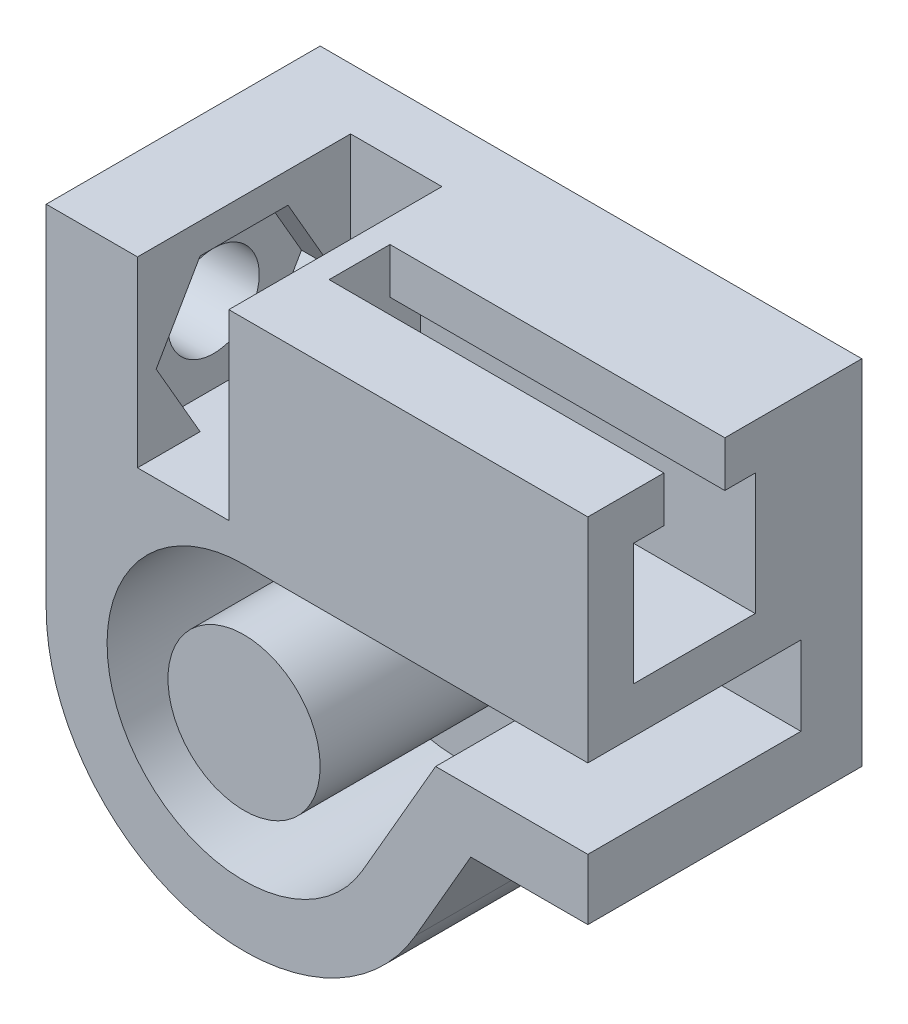
ISO-10303-21;
HEADER;
FILE_DESCRIPTION(('STEP AP214'),'2;1');
FILE_NAME('part.step','',(''),(''),'','','');
FILE_SCHEMA(('AUTOMOTIVE_DESIGN { 1 0 10303 214 1 1 1 1 }'));
ENDSEC;
DATA;
#1=APPLICATION_CONTEXT('core data for automotive mechanical design processes');
#2=APPLICATION_PROTOCOL_DEFINITION('international standard','automotive_design',2000,#1);
#3=PRODUCT_CONTEXT('',#1,'mechanical');
#4=PRODUCT('Part','Part','',(#3));
#5=PRODUCT_RELATED_PRODUCT_CATEGORY('part','',(#4));
#6=PRODUCT_DEFINITION_FORMATION('','',#4);
#7=PRODUCT_DEFINITION_CONTEXT('part definition',#1,'design');
#8=PRODUCT_DEFINITION('design','',#6,#7);
#9=PRODUCT_DEFINITION_SHAPE('','',#8);
#10=(LENGTH_UNIT() NAMED_UNIT(*) SI_UNIT(.MILLI.,.METRE.));
#11=(NAMED_UNIT(*) PLANE_ANGLE_UNIT() SI_UNIT($,.RADIAN.));
#12=(NAMED_UNIT(*) SI_UNIT($,.STERADIAN.) SOLID_ANGLE_UNIT());
#13=UNCERTAINTY_MEASURE_WITH_UNIT(LENGTH_MEASURE(1.E-05),#10,'distance_accuracy_value','');
#14=(GEOMETRIC_REPRESENTATION_CONTEXT(3) GLOBAL_UNCERTAINTY_ASSIGNED_CONTEXT((#13)) GLOBAL_UNIT_ASSIGNED_CONTEXT((#10,
#11,#12)) REPRESENTATION_CONTEXT('',''));
#15=CARTESIAN_POINT('',(0.,0.,0.));
#16=DIRECTION('',(0.,0.,1.));
#17=DIRECTION('',(1.,0.,0.));
#18=AXIS2_PLACEMENT_3D('',#15,#16,#17);
#19=CARTESIAN_POINT('',(0.,0.,0.));
#20=DIRECTION('',(0.,0.,1.));
#21=DIRECTION('',(1.,0.,0.));
#22=AXIS2_PLACEMENT_3D('',#19,#20,#21);
#23=PLANE('',#22);
#24=DIRECTION('',(0.,1.,0.));
#25=VECTOR('',#24,1.);
#26=CARTESIAN_POINT('',(-0.500000000000001,5.5,0.));
#27=LINE('',#26,#25);
#28=CARTESIAN_POINT('',(-0.500000000000001,5.5,0.));
#29=VERTEX_POINT('',#28);
#30=CARTESIAN_POINT('',(-0.500000000000001,11.5,0.));
#31=VERTEX_POINT('',#30);
#32=EDGE_CURVE('E441',#29,#31,#27,.T.);
#33=ORIENTED_EDGE('',*,*,#32,.T.);
#34=DIRECTION('',(-1.,0.,0.));
#35=VECTOR('',#34,1.);
#36=CARTESIAN_POINT('',(0.,11.5,0.));
#37=LINE('',#36,#35);
#38=CARTESIAN_POINT('',(-3.5,11.5,0.));
#39=VERTEX_POINT('',#38);
#40=EDGE_CURVE('E494',#31,#39,#37,.T.);
#41=ORIENTED_EDGE('',*,*,#40,.T.);
#42=DIRECTION('',(0.,-1.,0.));
#43=VECTOR('',#42,1.);
#44=CARTESIAN_POINT('',(-3.5,11.5,0.));
#45=LINE('',#44,#43);
#46=CARTESIAN_POINT('',(-3.5,5.5,0.));
#47=VERTEX_POINT('',#46);
#48=EDGE_CURVE('E106',#39,#47,#45,.T.);
#49=ORIENTED_EDGE('',*,*,#48,.T.);
#50=DIRECTION('',(1.,0.,0.));
#51=VECTOR('',#50,1.);
#52=CARTESIAN_POINT('',(-3.5,5.5,0.));
#53=LINE('',#52,#51);
#54=EDGE_CURVE('E101',#47,#29,#53,.T.);
#55=ORIENTED_EDGE('',*,*,#54,.T.);
#56=EDGE_LOOP('',(#33,#41,#49,#55));
#57=FACE_BOUND('',#56,.T.);
#58=ADVANCED_FACE('F86',(#57),#23,.T.);
#59=CARTESIAN_POINT('',(0.,0.,7.));
#60=DIRECTION('',(0.,0.,-1.));
#61=DIRECTION('',(-1.,0.,0.));
#62=AXIS2_PLACEMENT_3D('',#59,#60,#61);
#63=CYLINDRICAL_SURFACE('',#62,2.5);
#64=CARTESIAN_POINT('',(0.,0.,7.));
#65=DIRECTION('',(0.,0.,1.));
#66=DIRECTION('',(1.,0.,0.));
#67=AXIS2_PLACEMENT_3D('',#64,#65,#66);
#68=CIRCLE('',#67,2.5);
#69=CARTESIAN_POINT('',(2.5,0.,7.));
#70=VERTEX_POINT('',#69);
#71=EDGE_CURVE('E12',#70,#70,#68,.T.);
#72=ORIENTED_EDGE('',*,*,#71,.F.);
#73=EDGE_LOOP('',(#72));
#74=FACE_BOUND('',#73,.T.);
#75=CARTESIAN_POINT('',(0.,0.,0.));
#76=DIRECTION('',(0.,0.,1.));
#77=DIRECTION('',(1.,0.,0.));
#78=AXIS2_PLACEMENT_3D('',#75,#76,#77);
#79=CIRCLE('',#78,2.5);
#80=CARTESIAN_POINT('',(2.5,0.,0.));
#81=VERTEX_POINT('',#80);
#82=EDGE_CURVE('E94',#81,#81,#79,.T.);
#83=ORIENTED_EDGE('',*,*,#82,.T.);
#84=EDGE_LOOP('',(#83));
#85=FACE_BOUND('',#84,.T.);
#86=ADVANCED_FACE('F88',(#74,#85),#63,.T.);
#87=CARTESIAN_POINT('',(0.,0.,7.));
#88=DIRECTION('',(0.,0.,1.));
#89=DIRECTION('',(1.,0.,0.));
#90=AXIS2_PLACEMENT_3D('',#87,#88,#89);
#91=PLANE('',#90);
#92=ORIENTED_EDGE('',*,*,#71,.T.);
#93=EDGE_LOOP('',(#92));
#94=FACE_BOUND('',#93,.T.);
#95=ADVANCED_FACE('F628',(#94),#91,.T.);
#96=CARTESIAN_POINT('',(11.2931179341669,0.,-2.));
#97=DIRECTION('',(-1.,0.,0.));
#98=DIRECTION('',(0.,-1.,0.));
#99=AXIS2_PLACEMENT_3D('',#96,#97,#98);
#100=PLANE('',#99);
#101=DIRECTION('',(0.,0.,1.));
#102=VECTOR('',#101,1.);
#103=CARTESIAN_POINT('',(11.2931179341669,11.5,-2.));
#104=LINE('',#103,#102);
#105=CARTESIAN_POINT('',(11.2931179341669,11.5,-2.));
#106=VERTEX_POINT('',#105);
#107=CARTESIAN_POINT('',(11.2931179341669,11.5,2.5));
#108=VERTEX_POINT('',#107);
#109=EDGE_CURVE('E509',#106,#108,#104,.T.);
#110=ORIENTED_EDGE('',*,*,#109,.T.);
#111=DIRECTION('',(0.,1.,0.));
#112=VECTOR('',#111,1.);
#113=CARTESIAN_POINT('',(11.2931179341669,9.99999999999999,2.5));
#114=LINE('',#113,#112);
#115=CARTESIAN_POINT('',(11.2931179341669,9.99999999999999,2.5));
#116=VERTEX_POINT('',#115);
#117=EDGE_CURVE('E323',#116,#108,#114,.T.);
#118=ORIENTED_EDGE('',*,*,#117,.F.);
#119=DIRECTION('',(0.,0.,1.));
#120=VECTOR('',#119,1.);
#121=CARTESIAN_POINT('',(11.2931179341669,9.99999999999999,2.5));
#122=LINE('',#121,#120);
#123=CARTESIAN_POINT('',(11.2931179341669,9.99999999999999,1.5));
#124=VERTEX_POINT('',#123);
#125=EDGE_CURVE('E321',#124,#116,#122,.T.);
#126=ORIENTED_EDGE('',*,*,#125,.F.);
#127=DIRECTION('',(0.,1.,0.));
#128=VECTOR('',#127,1.);
#129=CARTESIAN_POINT('',(11.2931179341669,9.99999999999999,1.5));
#130=LINE('',#129,#128);
#131=CARTESIAN_POINT('',(11.2931179341669,6.,1.5));
#132=VERTEX_POINT('',#131);
#133=EDGE_CURVE('E283',#132,#124,#130,.T.);
#134=ORIENTED_EDGE('',*,*,#133,.F.);
#135=DIRECTION('',(0.,0.,-1.));
#136=VECTOR('',#135,1.);
#137=CARTESIAN_POINT('',(11.2931179341669,6.,5.5));
#138=LINE('',#137,#136);
#139=CARTESIAN_POINT('',(11.2931179341669,6.,5.5));
#140=VERTEX_POINT('',#139);
#141=EDGE_CURVE('E301',#140,#132,#138,.T.);
#142=ORIENTED_EDGE('',*,*,#141,.F.);
#143=DIRECTION('',(0.,-1.,0.));
#144=VECTOR('',#143,1.);
#145=CARTESIAN_POINT('',(11.2931179341669,9.99999999999999,5.5));
#146=LINE('',#145,#144);
#147=CARTESIAN_POINT('',(11.2931179341669,9.99999999999999,5.5));
#148=VERTEX_POINT('',#147);
#149=EDGE_CURVE('E304',#148,#140,#146,.T.);
#150=ORIENTED_EDGE('',*,*,#149,.F.);
#151=DIRECTION('',(0.,0.,1.));
#152=VECTOR('',#151,1.);
#153=CARTESIAN_POINT('',(11.2931179341669,9.99999999999999,5.5));
#154=LINE('',#153,#152);
#155=CARTESIAN_POINT('',(11.2931179341669,9.99999999999999,4.5));
#156=VERTEX_POINT('',#155);
#157=EDGE_CURVE('E329',#156,#148,#154,.T.);
#158=ORIENTED_EDGE('',*,*,#157,.F.);
#159=DIRECTION('',(0.,-1.,0.));
#160=VECTOR('',#159,1.);
#161=CARTESIAN_POINT('',(11.2931179341669,9.99999999999999,4.5));
#162=LINE('',#161,#160);
#163=CARTESIAN_POINT('',(11.2931179341669,11.5,4.5));
#164=VERTEX_POINT('',#163);
#165=EDGE_CURVE('E326',#164,#156,#162,.T.);
#166=ORIENTED_EDGE('',*,*,#165,.F.);
#167=DIRECTION('',(0.,0.,-1.));
#168=VECTOR('',#167,1.);
#169=CARTESIAN_POINT('',(11.2931179341669,11.5,7.));
#170=LINE('',#169,#168);
#171=CARTESIAN_POINT('',(11.2931179341669,11.5,7.));
#172=VERTEX_POINT('',#171);
#173=EDGE_CURVE('E404',#172,#164,#170,.T.);
#174=ORIENTED_EDGE('',*,*,#173,.F.);
#175=DIRECTION('',(0.,1.,0.));
#176=VECTOR('',#175,1.);
#177=CARTESIAN_POINT('',(11.2931179341669,4.5,7.));
#178=LINE('',#177,#176);
#179=CARTESIAN_POINT('',(11.2931179341669,4.5,7.));
#180=VERTEX_POINT('',#179);
#181=EDGE_CURVE('E483',#180,#172,#178,.T.);
#182=ORIENTED_EDGE('',*,*,#181,.F.);
#183=DIRECTION('',(0.,0.,-1.));
#184=VECTOR('',#183,1.);
#185=CARTESIAN_POINT('',(11.2931179341669,4.5,7.));
#186=LINE('',#185,#184);
#187=CARTESIAN_POINT('',(11.2931179341669,4.5,0.));
#188=VERTEX_POINT('',#187);
#189=EDGE_CURVE('E391',#180,#188,#186,.T.);
#190=ORIENTED_EDGE('',*,*,#189,.T.);
#191=DIRECTION('',(0.,-1.,0.));
#192=VECTOR('',#191,1.);
#193=CARTESIAN_POINT('',(11.2931179341669,0.,0.));
#194=LINE('',#193,#192);
#195=CARTESIAN_POINT('',(11.2931179341669,1.9,0.));
#196=VERTEX_POINT('',#195);
#197=EDGE_CURVE('E446',#188,#196,#194,.T.);
#198=ORIENTED_EDGE('',*,*,#197,.T.);
#199=DIRECTION('',(0.,0.,-1.));
#200=VECTOR('',#199,1.);
#201=CARTESIAN_POINT('',(11.2931179341669,1.9,7.));
#202=LINE('',#201,#200);
#203=CARTESIAN_POINT('',(11.2931179341669,1.9,7.));
#204=VERTEX_POINT('',#203);
#205=EDGE_CURVE('E419',#204,#196,#202,.T.);
#206=ORIENTED_EDGE('',*,*,#205,.F.);
#207=DIRECTION('',(0.,1.,0.));
#208=VECTOR('',#207,1.);
#209=CARTESIAN_POINT('',(11.2931179341669,-0.0999999999999994,7.));
#210=LINE('',#209,#208);
#211=CARTESIAN_POINT('',(11.2931179341669,-0.0999999999999994,7.));
#212=VERTEX_POINT('',#211);
#213=EDGE_CURVE('E455',#212,#204,#210,.T.);
#214=ORIENTED_EDGE('',*,*,#213,.F.);
#215=DIRECTION('',(0.,0.,1.));
#216=VECTOR('',#215,1.);
#217=CARTESIAN_POINT('',(11.2931179341669,-0.0999999999999994,-2.));
#218=LINE('',#217,#216);
#219=CARTESIAN_POINT('',(11.2931179341669,-0.0999999999999994,-2.));
#220=VERTEX_POINT('',#219);
#221=EDGE_CURVE('E513',#220,#212,#218,.T.);
#222=ORIENTED_EDGE('',*,*,#221,.F.);
#223=DIRECTION('',(0.,-1.,0.));
#224=VECTOR('',#223,1.);
#225=CARTESIAN_POINT('',(11.2931179341669,0.,-2.));
#226=LINE('',#225,#224);
#227=EDGE_CURVE('E491',#106,#220,#226,.T.);
#228=ORIENTED_EDGE('',*,*,#227,.F.);
#229=EDGE_LOOP('',(#110,#118,#126,#134,#142,#150,#158,#166,#174,#182,#190,#198,#206,#214,#222,#228));
#230=FACE_BOUND('',#229,.T.);
#231=ADVANCED_FACE('F537',(#230),#100,.F.);
#232=CARTESIAN_POINT('',(0.,-0.0999999999999994,-2.));
#233=DIRECTION('',(0.,-1.,0.));
#234=DIRECTION('',(0.,0.,-1.));
#235=AXIS2_PLACEMENT_3D('',#232,#233,#234);
#236=PLANE('',#235);
#237=ORIENTED_EDGE('',*,*,#221,.T.);
#238=DIRECTION('',(1.,0.,0.));
#239=VECTOR('',#238,1.);
#240=CARTESIAN_POINT('',(7.44781847254616,-0.0999999999999994,7.));
#241=LINE('',#240,#239);
#242=CARTESIAN_POINT('',(7.44781847254616,-0.0999999999999994,7.));
#243=VERTEX_POINT('',#242);
#244=EDGE_CURVE('E457',#243,#212,#241,.T.);
#245=ORIENTED_EDGE('',*,*,#244,.F.);
#246=DIRECTION('',(0.,0.,1.));
#247=VECTOR('',#246,1.);
#248=CARTESIAN_POINT('',(7.44781847254616,-0.0999999999999994,-2.));
#249=LINE('',#248,#247);
#250=CARTESIAN_POINT('',(7.44781847254616,-0.0999999999999994,-2.));
#251=VERTEX_POINT('',#250);
#252=EDGE_CURVE('E515',#251,#243,#249,.T.);
#253=ORIENTED_EDGE('',*,*,#252,.F.);
#254=DIRECTION('',(1.,0.,0.));
#255=VECTOR('',#254,1.);
#256=CARTESIAN_POINT('',(0.,-0.0999999999999994,-2.));
#257=LINE('',#256,#255);
#258=EDGE_CURVE('E506',#251,#220,#257,.T.);
#259=ORIENTED_EDGE('',*,*,#258,.T.);
#260=EDGE_LOOP('',(#237,#245,#253,#259));
#261=FACE_BOUND('',#260,.T.);
#262=ADVANCED_FACE('F561',(#261),#236,.T.);
#263=CARTESIAN_POINT('',(5.62916512459886,-3.24999999999998,-2.));
#264=DIRECTION('',(0.86602540378444,-0.499999999999998,0.));
#265=DIRECTION('',(0.499999999999998,0.86602540378444,0.));
#266=AXIS2_PLACEMENT_3D('',#263,#264,#265);
#267=PLANE('',#266);
#268=ORIENTED_EDGE('',*,*,#252,.T.);
#269=DIRECTION('',(-0.499999999999998,-0.86602540378444,0.));
#270=VECTOR('',#269,1.);
#271=CARTESIAN_POINT('',(7.44781847254616,-0.0999999999999994,7.));
#272=LINE('',#271,#270);
#273=CARTESIAN_POINT('',(5.62916512459886,-3.24999999999998,7.));
#274=VERTEX_POINT('',#273);
#275=EDGE_CURVE('E460',#243,#274,#272,.T.);
#276=ORIENTED_EDGE('',*,*,#275,.T.);
#277=DIRECTION('',(0.,0.,1.));
#278=VECTOR('',#277,1.);
#279=CARTESIAN_POINT('',(5.62916512459886,-3.24999999999998,-2.));
#280=LINE('',#279,#278);
#281=CARTESIAN_POINT('',(5.62916512459886,-3.24999999999998,-2.));
#282=VERTEX_POINT('',#281);
#283=EDGE_CURVE('E517',#282,#274,#280,.T.);
#284=ORIENTED_EDGE('',*,*,#283,.F.);
#285=DIRECTION('',(0.499999999999998,0.86602540378444,0.));
#286=VECTOR('',#285,1.);
#287=CARTESIAN_POINT('',(5.62916512459886,-3.24999999999998,-2.));
#288=LINE('',#287,#286);
#289=EDGE_CURVE('E503',#282,#251,#288,.T.);
#290=ORIENTED_EDGE('',*,*,#289,.T.);
#291=EDGE_LOOP('',(#268,#276,#284,#290));
#292=FACE_BOUND('',#291,.T.);
#293=ADVANCED_FACE('F615',(#292),#267,.T.);
#294=CARTESIAN_POINT('',(0.,0.,-2.));
#295=DIRECTION('',(0.,0.,1.));
#296=DIRECTION('',(1.,0.,0.));
#297=AXIS2_PLACEMENT_3D('',#294,#295,#296);
#298=CYLINDRICAL_SURFACE('',#297,6.5);
#299=ORIENTED_EDGE('',*,*,#283,.T.);
#300=CARTESIAN_POINT('',(0.,0.,7.));
#301=DIRECTION('',(0.,0.,1.));
#302=DIRECTION('',(1.,0.,0.));
#303=AXIS2_PLACEMENT_3D('',#300,#301,#302);
#304=CIRCLE('',#303,6.5);
#305=CARTESIAN_POINT('',(-6.5,0.,7.));
#306=VERTEX_POINT('',#305);
#307=EDGE_CURVE('E463',#306,#274,#304,.T.);
#308=ORIENTED_EDGE('',*,*,#307,.F.);
#309=DIRECTION('',(0.,0.,1.));
#310=VECTOR('',#309,1.);
#311=CARTESIAN_POINT('',(-6.5,0.,-2.));
#312=LINE('',#311,#310);
#313=CARTESIAN_POINT('',(-6.5,0.,-2.));
#314=VERTEX_POINT('',#313);
#315=EDGE_CURVE('E519',#314,#306,#312,.T.);
#316=ORIENTED_EDGE('',*,*,#315,.F.);
#317=CARTESIAN_POINT('',(0.,0.,-2.));
#318=DIRECTION('',(0.,0.,1.));
#319=DIRECTION('',(1.,0.,0.));
#320=AXIS2_PLACEMENT_3D('',#317,#318,#319);
#321=CIRCLE('',#320,6.5);
#322=EDGE_CURVE('E500',#314,#282,#321,.T.);
#323=ORIENTED_EDGE('',*,*,#322,.T.);
#324=EDGE_LOOP('',(#299,#308,#316,#323));
#325=FACE_BOUND('',#324,.T.);
#326=ADVANCED_FACE('F613',(#325),#298,.T.);
#327=CARTESIAN_POINT('',(-6.5,0.,-2.));
#328=DIRECTION('',(-1.,0.,0.));
#329=DIRECTION('',(0.,-1.,0.));
#330=AXIS2_PLACEMENT_3D('',#327,#328,#329);
#331=PLANE('',#330);
#332=ORIENTED_EDGE('',*,*,#315,.T.);
#333=DIRECTION('',(0.,-1.,0.));
#334=VECTOR('',#333,1.);
#335=CARTESIAN_POINT('',(-6.5,11.5,7.));
#336=LINE('',#335,#334);
#337=CARTESIAN_POINT('',(-6.5,11.5,7.));
#338=VERTEX_POINT('',#337);
#339=EDGE_CURVE('E466',#338,#306,#336,.T.);
#340=ORIENTED_EDGE('',*,*,#339,.F.);
#341=DIRECTION('',(0.,0.,1.));
#342=VECTOR('',#341,1.);
#343=CARTESIAN_POINT('',(-6.5,11.5,-2.));
#344=LINE('',#343,#342);
#345=CARTESIAN_POINT('',(-6.5,11.5,-2.));
#346=VERTEX_POINT('',#345);
#347=EDGE_CURVE('E521',#346,#338,#344,.T.);
#348=ORIENTED_EDGE('',*,*,#347,.F.);
#349=DIRECTION('',(0.,-1.,0.));
#350=VECTOR('',#349,1.);
#351=CARTESIAN_POINT('',(-6.5,0.,-2.));
#352=LINE('',#351,#350);
#353=EDGE_CURVE('E497',#346,#314,#352,.T.);
#354=ORIENTED_EDGE('',*,*,#353,.T.);
#355=EDGE_LOOP('',(#332,#340,#348,#354));
#356=FACE_BOUND('',#355,.T.);
#357=CARTESIAN_POINT('',(-6.5,8.,3.5));
#358=DIRECTION('',(1.,0.,0.));
#359=DIRECTION('',(0.,1.,0.));
#360=AXIS2_PLACEMENT_3D('',#357,#358,#359);
#361=CIRCLE('',#360,1.5);
#362=CARTESIAN_POINT('',(-6.5,9.5,3.5));
#363=VERTEX_POINT('',#362);
#364=EDGE_CURVE('E349',#363,#363,#361,.T.);
#365=ORIENTED_EDGE('',*,*,#364,.T.);
#366=EDGE_LOOP('',(#365));
#367=FACE_BOUND('',#366,.T.);
#368=ADVANCED_FACE('F610',(#356,#367),#331,.T.);
#369=CARTESIAN_POINT('',(0.,11.5,-2.));
#370=DIRECTION('',(0.,1.,0.));
#371=DIRECTION('',(-1.,0.,0.));
#372=AXIS2_PLACEMENT_3D('',#369,#370,#371);
#373=PLANE('',#372);
#374=ORIENTED_EDGE('',*,*,#40,.F.);
#375=DIRECTION('',(0.,0.,-1.));
#376=VECTOR('',#375,1.);
#377=CARTESIAN_POINT('',(-0.500000000000001,11.5,7.));
#378=LINE('',#377,#376);
#379=CARTESIAN_POINT('',(-0.500000000000001,11.5,7.));
#380=VERTEX_POINT('',#379);
#381=EDGE_CURVE('E407',#380,#31,#378,.T.);
#382=ORIENTED_EDGE('',*,*,#381,.F.);
#383=DIRECTION('',(-1.,0.,0.));
#384=VECTOR('',#383,1.);
#385=CARTESIAN_POINT('',(11.2931179341669,11.5,7.));
#386=LINE('',#385,#384);
#387=EDGE_CURVE('E481',#172,#380,#386,.T.);
#388=ORIENTED_EDGE('',*,*,#387,.F.);
#389=ORIENTED_EDGE('',*,*,#173,.T.);
#390=DIRECTION('',(1.,0.,0.));
#391=VECTOR('',#390,1.);
#392=CARTESIAN_POINT('',(0.293117934166908,11.5,4.5));
#393=LINE('',#392,#391);
#394=CARTESIAN_POINT('',(0.293117934166908,11.5,4.5));
#395=VERTEX_POINT('',#394);
#396=EDGE_CURVE('E343',#395,#164,#393,.T.);
#397=ORIENTED_EDGE('',*,*,#396,.F.);
#398=DIRECTION('',(0.,0.,1.));
#399=VECTOR('',#398,1.);
#400=CARTESIAN_POINT('',(0.293117934166908,11.5,4.5));
#401=LINE('',#400,#399);
#402=CARTESIAN_POINT('',(0.293117934166908,11.5,2.5));
#403=VERTEX_POINT('',#402);
#404=EDGE_CURVE('E308',#403,#395,#401,.T.);
#405=ORIENTED_EDGE('',*,*,#404,.F.);
#406=DIRECTION('',(1.,0.,0.));
#407=VECTOR('',#406,1.);
#408=CARTESIAN_POINT('',(0.293117934166908,11.5,2.5));
#409=LINE('',#408,#407);
#410=EDGE_CURVE('E345',#403,#108,#409,.T.);
#411=ORIENTED_EDGE('',*,*,#410,.T.);
#412=ORIENTED_EDGE('',*,*,#109,.F.);
#413=DIRECTION('',(-1.,0.,0.));
#414=VECTOR('',#413,1.);
#415=CARTESIAN_POINT('',(0.,11.5,-2.));
#416=LINE('',#415,#414);
#417=EDGE_CURVE('E493',#106,#346,#416,.T.);
#418=ORIENTED_EDGE('',*,*,#417,.T.);
#419=ORIENTED_EDGE('',*,*,#347,.T.);
#420=DIRECTION('',(-1.,0.,0.));
#421=VECTOR('',#420,1.);
#422=CARTESIAN_POINT('',(-3.5,11.5,7.));
#423=LINE('',#422,#421);
#424=CARTESIAN_POINT('',(-3.5,11.5,7.));
#425=VERTEX_POINT('',#424);
#426=EDGE_CURVE('E469',#425,#338,#423,.T.);
#427=ORIENTED_EDGE('',*,*,#426,.F.);
#428=DIRECTION('',(0.,0.,-1.));
#429=VECTOR('',#428,1.);
#430=CARTESIAN_POINT('',(-3.5,11.5,7.));
#431=LINE('',#430,#429);
#432=EDGE_CURVE('E416',#425,#39,#431,.T.);
#433=ORIENTED_EDGE('',*,*,#432,.T.);
#434=EDGE_LOOP('',(#374,#382,#388,#389,#397,#405,#411,#412,#418,#419,#427,#433));
#435=FACE_BOUND('',#434,.T.);
#436=ADVANCED_FACE('F575',(#435),#373,.T.);
#437=CARTESIAN_POINT('',(0.,0.,-2.));
#438=DIRECTION('',(0.,0.,1.));
#439=DIRECTION('',(1.,0.,0.));
#440=AXIS2_PLACEMENT_3D('',#437,#438,#439);
#441=PLANE('',#440);
#442=ORIENTED_EDGE('',*,*,#227,.T.);
#443=ORIENTED_EDGE('',*,*,#258,.F.);
#444=ORIENTED_EDGE('',*,*,#289,.F.);
#445=ORIENTED_EDGE('',*,*,#322,.F.);
#446=ORIENTED_EDGE('',*,*,#353,.F.);
#447=ORIENTED_EDGE('',*,*,#417,.F.);
#448=EDGE_LOOP('',(#442,#443,#444,#445,#446,#447));
#449=FACE_BOUND('',#448,.T.);
#450=ADVANCED_FACE('F531',(#449),#441,.F.);
#451=ORIENTED_EDGE('',*,*,#82,.F.);
#452=EDGE_LOOP('',(#451));
#453=FACE_BOUND('',#452,.T.);
#454=ORIENTED_EDGE('',*,*,#197,.F.);
#455=DIRECTION('',(1.,0.,0.));
#456=VECTOR('',#455,1.);
#457=CARTESIAN_POINT('',(0.,4.5,0.));
#458=LINE('',#457,#456);
#459=CARTESIAN_POINT('',(0.,4.5,0.));
#460=VERTEX_POINT('',#459);
#461=EDGE_CURVE('E443',#460,#188,#458,.T.);
#462=ORIENTED_EDGE('',*,*,#461,.F.);
#463=CARTESIAN_POINT('',(0.,0.,0.));
#464=DIRECTION('',(0.,0.,1.));
#465=DIRECTION('',(1.,0.,0.));
#466=AXIS2_PLACEMENT_3D('',#463,#464,#465);
#467=CIRCLE('',#466,4.5);
#468=CARTESIAN_POINT('',(3.89711431702998,-2.24999999999999,0.));
#469=VERTEX_POINT('',#468);
#470=EDGE_CURVE('E432',#460,#469,#467,.T.);
#471=ORIENTED_EDGE('',*,*,#470,.T.);
#472=DIRECTION('',(0.499999999999998,0.86602540378444,0.));
#473=VECTOR('',#472,1.);
#474=CARTESIAN_POINT('',(3.89711431702998,-2.24999999999999,0.));
#475=LINE('',#474,#473);
#476=CARTESIAN_POINT('',(6.29311793416691,1.9,0.));
#477=VERTEX_POINT('',#476);
#478=EDGE_CURVE('E434',#469,#477,#475,.T.);
#479=ORIENTED_EDGE('',*,*,#478,.T.);
#480=DIRECTION('',(1.,0.,0.));
#481=VECTOR('',#480,1.);
#482=CARTESIAN_POINT('',(6.29311793416691,1.9,0.));
#483=LINE('',#482,#481);
#484=EDGE_CURVE('E437',#477,#196,#483,.T.);
#485=ORIENTED_EDGE('',*,*,#484,.T.);
#486=EDGE_LOOP('',(#454,#462,#471,#479,#485));
#487=FACE_BOUND('',#486,.T.);
#488=ADVANCED_FACE('F527',(#453,#487),#23,.T.);
#489=CARTESIAN_POINT('',(-6.5,8.,3.5));
#490=DIRECTION('',(1.,0.,0.));
#491=DIRECTION('',(0.,1.,0.));
#492=AXIS2_PLACEMENT_3D('',#489,#490,#491);
#493=CYLINDRICAL_SURFACE('',#492,1.5);
#494=CARTESIAN_POINT('',(-0.5,8.,3.5));
#495=DIRECTION('',(-1.,0.,0.));
#496=DIRECTION('',(0.,0.,1.));
#497=AXIS2_PLACEMENT_3D('',#494,#495,#496);
#498=CIRCLE('',#497,1.5);
#499=CARTESIAN_POINT('',(-0.5,8.,5.));
#500=VERTEX_POINT('',#499);
#501=EDGE_CURVE('E353',#500,#500,#498,.T.);
#502=ORIENTED_EDGE('',*,*,#501,.T.);
#503=EDGE_LOOP('',(#502));
#504=FACE_BOUND('',#503,.T.);
#505=CARTESIAN_POINT('',(0.293117934166904,8.,3.5));
#506=DIRECTION('',(1.,0.,0.));
#507=DIRECTION('',(0.,1.,0.));
#508=AXIS2_PLACEMENT_3D('',#505,#506,#507);
#509=CIRCLE('',#508,1.5);
#510=CARTESIAN_POINT('',(0.293117934166906,9.5,3.5));
#511=VERTEX_POINT('',#510);
#512=EDGE_CURVE('E336',#511,#511,#509,.F.);
#513=ORIENTED_EDGE('',*,*,#512,.F.);
#514=EDGE_LOOP('',(#513));
#515=FACE_BOUND('',#514,.T.);
#516=ADVANCED_FACE('F530',(#504,#515),#493,.F.);
#517=CARTESIAN_POINT('',(0.,4.5,7.));
#518=DIRECTION('',(0.,1.,0.));
#519=DIRECTION('',(0.,0.,1.));
#520=AXIS2_PLACEMENT_3D('',#517,#518,#519);
#521=PLANE('',#520);
#522=ORIENTED_EDGE('',*,*,#461,.T.);
#523=ORIENTED_EDGE('',*,*,#189,.F.);
#524=DIRECTION('',(1.,0.,0.));
#525=VECTOR('',#524,1.);
#526=CARTESIAN_POINT('',(0.,4.5,7.));
#527=LINE('',#526,#525);
#528=CARTESIAN_POINT('',(0.,4.5,7.));
#529=VERTEX_POINT('',#528);
#530=EDGE_CURVE('E435',#529,#180,#527,.T.);
#531=ORIENTED_EDGE('',*,*,#530,.F.);
#532=DIRECTION('',(0.,0.,-1.));
#533=VECTOR('',#532,1.);
#534=CARTESIAN_POINT('',(0.,4.5,7.));
#535=LINE('',#534,#533);
#536=EDGE_CURVE('E428',#529,#460,#535,.T.);
#537=ORIENTED_EDGE('',*,*,#536,.T.);
#538=EDGE_LOOP('',(#522,#523,#531,#537));
#539=FACE_BOUND('',#538,.T.);
#540=ADVANCED_FACE('F541',(#539),#521,.F.);
#541=CARTESIAN_POINT('',(-0.500000000000001,5.5,7.));
#542=DIRECTION('',(-1.,0.,0.));
#543=DIRECTION('',(0.,0.,1.));
#544=AXIS2_PLACEMENT_3D('',#541,#542,#543);
#545=PLANE('',#544);
#546=ORIENTED_EDGE('',*,*,#501,.F.);
#547=EDGE_LOOP('',(#546));
#548=FACE_BOUND('',#547,.T.);
#549=ORIENTED_EDGE('',*,*,#32,.F.);
#550=DIRECTION('',(0.,0.,-1.));
#551=VECTOR('',#550,1.);
#552=CARTESIAN_POINT('',(-0.500000000000001,5.5,7.));
#553=LINE('',#552,#551);
#554=CARTESIAN_POINT('',(-0.500000000000001,5.5,7.));
#555=VERTEX_POINT('',#554);
#556=EDGE_CURVE('E410',#555,#29,#553,.T.);
#557=ORIENTED_EDGE('',*,*,#556,.F.);
#558=DIRECTION('',(0.,1.,0.));
#559=VECTOR('',#558,1.);
#560=CARTESIAN_POINT('',(-0.500000000000001,5.5,7.));
#561=LINE('',#560,#559);
#562=EDGE_CURVE('E478',#555,#380,#561,.T.);
#563=ORIENTED_EDGE('',*,*,#562,.T.);
#564=ORIENTED_EDGE('',*,*,#381,.T.);
#565=EDGE_LOOP('',(#549,#557,#563,#564));
#566=FACE_BOUND('',#565,.T.);
#567=ADVANCED_FACE('F646',(#548,#566),#545,.T.);
#568=CARTESIAN_POINT('',(-3.5,5.5,7.));
#569=DIRECTION('',(0.,1.,0.));
#570=DIRECTION('',(-1.,0.,0.));
#571=AXIS2_PLACEMENT_3D('',#568,#569,#570);
#572=PLANE('',#571);
#573=ORIENTED_EDGE('',*,*,#54,.F.);
#574=DIRECTION('',(0.,0.,-1.));
#575=VECTOR('',#574,1.);
#576=CARTESIAN_POINT('',(-3.5,5.5,7.));
#577=LINE('',#576,#575);
#578=CARTESIAN_POINT('',(-3.5,5.5,2.05662432702593));
#579=VERTEX_POINT('',#578);
#580=EDGE_CURVE('E412',#579,#47,#577,.T.);
#581=ORIENTED_EDGE('',*,*,#580,.F.);
#582=DIRECTION('',(1.,0.,0.));
#583=VECTOR('',#582,1.);
#584=CARTESIAN_POINT('',(-4.5,5.5,2.05662432702593));
#585=LINE('',#584,#583);
#586=CARTESIAN_POINT('',(-4.5,5.5,2.05662432702593));
#587=VERTEX_POINT('',#586);
#588=EDGE_CURVE('E389',#587,#579,#585,.T.);
#589=ORIENTED_EDGE('',*,*,#588,.F.);
#590=DIRECTION('',(0.,0.,-1.));
#591=VECTOR('',#590,1.);
#592=CARTESIAN_POINT('',(-4.5,5.5,4.94337567297407));
#593=LINE('',#592,#591);
#594=CARTESIAN_POINT('',(-4.5,5.5,4.94337567297407));
#595=VERTEX_POINT('',#594);
#596=EDGE_CURVE('E373',#595,#587,#593,.T.);
#597=ORIENTED_EDGE('',*,*,#596,.F.);
#598=DIRECTION('',(1.,0.,0.));
#599=VECTOR('',#598,1.);
#600=CARTESIAN_POINT('',(-4.5,5.5,4.94337567297407));
#601=LINE('',#600,#599);
#602=CARTESIAN_POINT('',(-3.5,5.5,4.94337567297407));
#603=VERTEX_POINT('',#602);
#604=EDGE_CURVE('E392',#595,#603,#601,.T.);
#605=ORIENTED_EDGE('',*,*,#604,.T.);
#606=CARTESIAN_POINT('',(-3.5,5.5,7.));
#607=VERTEX_POINT('',#606);
#608=EDGE_CURVE('E413',#607,#603,#577,.T.);
#609=ORIENTED_EDGE('',*,*,#608,.F.);
#610=DIRECTION('',(1.,0.,0.));
#611=VECTOR('',#610,1.);
#612=CARTESIAN_POINT('',(-3.5,5.5,7.));
#613=LINE('',#612,#611);
#614=EDGE_CURVE('E475',#607,#555,#613,.T.);
#615=ORIENTED_EDGE('',*,*,#614,.T.);
#616=ORIENTED_EDGE('',*,*,#556,.T.);
#617=EDGE_LOOP('',(#573,#581,#589,#597,#605,#609,#615,#616));
#618=FACE_BOUND('',#617,.T.);
#619=ADVANCED_FACE('F598',(#618),#572,.T.);
#620=CARTESIAN_POINT('',(-3.5,11.5,7.));
#621=DIRECTION('',(1.,0.,0.));
#622=DIRECTION('',(0.,1.,0.));
#623=AXIS2_PLACEMENT_3D('',#620,#621,#622);
#624=PLANE('',#623);
#625=DIRECTION('',(0.,0.866025403784439,-0.5));
#626=VECTOR('',#625,1.);
#627=CARTESIAN_POINT('',(-3.5,5.5,2.05662432702593));
#628=LINE('',#627,#626);
#629=CARTESIAN_POINT('',(-3.5,8.,0.613248654051869));
#630=VERTEX_POINT('',#629);
#631=EDGE_CURVE('E356',#579,#630,#628,.T.);
#632=ORIENTED_EDGE('',*,*,#631,.F.);
#633=ORIENTED_EDGE('',*,*,#580,.T.);
#634=ORIENTED_EDGE('',*,*,#48,.F.);
#635=ORIENTED_EDGE('',*,*,#432,.F.);
#636=DIRECTION('',(0.,-1.,0.));
#637=VECTOR('',#636,1.);
#638=CARTESIAN_POINT('',(-3.5,11.5,7.));
#639=LINE('',#638,#637);
#640=EDGE_CURVE('E472',#425,#607,#639,.T.);
#641=ORIENTED_EDGE('',*,*,#640,.T.);
#642=ORIENTED_EDGE('',*,*,#608,.T.);
#643=DIRECTION('',(0.,-0.866025403784438,-0.5));
#644=VECTOR('',#643,1.);
#645=CARTESIAN_POINT('',(-3.5,8.,6.38675134594813));
#646=LINE('',#645,#644);
#647=CARTESIAN_POINT('',(-3.5,8.,6.38675134594813));
#648=VERTEX_POINT('',#647);
#649=EDGE_CURVE('E361',#648,#603,#646,.T.);
#650=ORIENTED_EDGE('',*,*,#649,.F.);
#651=DIRECTION('',(0.,-0.866025403784438,0.500000000000001));
#652=VECTOR('',#651,1.);
#653=CARTESIAN_POINT('',(-3.5,10.5,4.94337567297407));
#654=LINE('',#653,#652);
#655=CARTESIAN_POINT('',(-3.5,10.5,4.94337567297407));
#656=VERTEX_POINT('',#655);
#657=EDGE_CURVE('E384',#656,#648,#654,.T.);
#658=ORIENTED_EDGE('',*,*,#657,.F.);
#659=DIRECTION('',(0.,0.,1.));
#660=VECTOR('',#659,1.);
#661=CARTESIAN_POINT('',(-3.5,10.5,2.05662432702594));
#662=LINE('',#661,#660);
#663=CARTESIAN_POINT('',(-3.5,10.5,2.05662432702594));
#664=VERTEX_POINT('',#663);
#665=EDGE_CURVE('E381',#664,#656,#662,.T.);
#666=ORIENTED_EDGE('',*,*,#665,.F.);
#667=DIRECTION('',(0.,0.866025403784439,0.5));
#668=VECTOR('',#667,1.);
#669=CARTESIAN_POINT('',(-3.5,8.,0.613248654051869));
#670=LINE('',#669,#668);
#671=EDGE_CURVE('E378',#630,#664,#670,.T.);
#672=ORIENTED_EDGE('',*,*,#671,.F.);
#673=EDGE_LOOP('',(#632,#633,#634,#635,#641,#642,#650,#658,#666,#672));
#674=FACE_BOUND('',#673,.T.);
#675=ADVANCED_FACE('F604',(#674),#624,.T.);
#676=CARTESIAN_POINT('',(6.29311793416691,1.9,7.));
#677=DIRECTION('',(0.,1.,0.));
#678=DIRECTION('',(0.,0.,1.));
#679=AXIS2_PLACEMENT_3D('',#676,#677,#678);
#680=PLANE('',#679);
#681=ORIENTED_EDGE('',*,*,#484,.F.);
#682=DIRECTION('',(0.,0.,-1.));
#683=VECTOR('',#682,1.);
#684=CARTESIAN_POINT('',(6.29311793416691,1.9,7.));
#685=LINE('',#684,#683);
#686=CARTESIAN_POINT('',(6.29311793416691,1.9,7.));
#687=VERTEX_POINT('',#686);
#688=EDGE_CURVE('E422',#687,#477,#685,.T.);
#689=ORIENTED_EDGE('',*,*,#688,.F.);
#690=DIRECTION('',(1.,0.,0.));
#691=VECTOR('',#690,1.);
#692=CARTESIAN_POINT('',(6.29311793416691,1.9,7.));
#693=LINE('',#692,#691);
#694=EDGE_CURVE('E452',#687,#204,#693,.T.);
#695=ORIENTED_EDGE('',*,*,#694,.T.);
#696=ORIENTED_EDGE('',*,*,#205,.T.);
#697=EDGE_LOOP('',(#681,#689,#695,#696));
#698=FACE_BOUND('',#697,.T.);
#699=ADVANCED_FACE('F552',(#698),#680,.T.);
#700=CARTESIAN_POINT('',(3.89711431702998,-2.24999999999999,7.));
#701=DIRECTION('',(-0.86602540378444,0.499999999999998,0.));
#702=DIRECTION('',(-0.499999999999998,-0.86602540378444,0.));
#703=AXIS2_PLACEMENT_3D('',#700,#701,#702);
#704=PLANE('',#703);
#705=ORIENTED_EDGE('',*,*,#478,.F.);
#706=DIRECTION('',(0.,0.,-1.));
#707=VECTOR('',#706,1.);
#708=CARTESIAN_POINT('',(3.89711431702998,-2.24999999999999,7.));
#709=LINE('',#708,#707);
#710=CARTESIAN_POINT('',(3.89711431702998,-2.24999999999999,7.));
#711=VERTEX_POINT('',#710);
#712=EDGE_CURVE('E425',#711,#469,#709,.T.);
#713=ORIENTED_EDGE('',*,*,#712,.F.);
#714=DIRECTION('',(0.499999999999998,0.86602540378444,0.));
#715=VECTOR('',#714,1.);
#716=CARTESIAN_POINT('',(3.89711431702998,-2.24999999999999,7.));
#717=LINE('',#716,#715);
#718=EDGE_CURVE('E449',#711,#687,#717,.T.);
#719=ORIENTED_EDGE('',*,*,#718,.T.);
#720=ORIENTED_EDGE('',*,*,#688,.T.);
#721=EDGE_LOOP('',(#705,#713,#719,#720));
#722=FACE_BOUND('',#721,.T.);
#723=ADVANCED_FACE('F548',(#722),#704,.T.);
#724=CARTESIAN_POINT('',(0.,0.,7.));
#725=DIRECTION('',(0.,0.,-1.));
#726=DIRECTION('',(-1.,0.,0.));
#727=AXIS2_PLACEMENT_3D('',#724,#725,#726);
#728=CYLINDRICAL_SURFACE('',#727,4.5);
#729=ORIENTED_EDGE('',*,*,#470,.F.);
#730=ORIENTED_EDGE('',*,*,#536,.F.);
#731=CARTESIAN_POINT('',(0.,0.,7.));
#732=DIRECTION('',(0.,0.,1.));
#733=DIRECTION('',(1.,0.,0.));
#734=AXIS2_PLACEMENT_3D('',#731,#732,#733);
#735=CIRCLE('',#734,4.5);
#736=EDGE_CURVE('E431',#529,#711,#735,.T.);
#737=ORIENTED_EDGE('',*,*,#736,.T.);
#738=ORIENTED_EDGE('',*,*,#712,.T.);
#739=EDGE_LOOP('',(#729,#730,#737,#738));
#740=FACE_BOUND('',#739,.T.);
#741=ADVANCED_FACE('F545',(#740),#728,.F.);
#742=CARTESIAN_POINT('',(0.,0.,7.));
#743=DIRECTION('',(0.,0.,1.));
#744=DIRECTION('',(1.,0.,0.));
#745=AXIS2_PLACEMENT_3D('',#742,#743,#744);
#746=PLANE('',#745);
#747=ORIENTED_EDGE('',*,*,#530,.T.);
#748=ORIENTED_EDGE('',*,*,#181,.T.);
#749=ORIENTED_EDGE('',*,*,#387,.T.);
#750=ORIENTED_EDGE('',*,*,#562,.F.);
#751=ORIENTED_EDGE('',*,*,#614,.F.);
#752=ORIENTED_EDGE('',*,*,#640,.F.);
#753=ORIENTED_EDGE('',*,*,#426,.T.);
#754=ORIENTED_EDGE('',*,*,#339,.T.);
#755=ORIENTED_EDGE('',*,*,#307,.T.);
#756=ORIENTED_EDGE('',*,*,#275,.F.);
#757=ORIENTED_EDGE('',*,*,#244,.T.);
#758=ORIENTED_EDGE('',*,*,#213,.T.);
#759=ORIENTED_EDGE('',*,*,#694,.F.);
#760=ORIENTED_EDGE('',*,*,#718,.F.);
#761=ORIENTED_EDGE('',*,*,#736,.F.);
#762=EDGE_LOOP('',(#747,#748,#749,#750,#751,#752,#753,#754,#755,#756,#757,#758,#759,#760,#761));
#763=FACE_BOUND('',#762,.T.);
#764=ADVANCED_FACE('F557',(#763),#746,.T.);
#765=CARTESIAN_POINT('',(-4.5,5.5,2.05662432702593));
#766=DIRECTION('',(0.,-0.5,-0.866025403784439));
#767=DIRECTION('',(0.,0.866025403784439,-0.5));
#768=AXIS2_PLACEMENT_3D('',#765,#766,#767);
#769=PLANE('',#768);
#770=ORIENTED_EDGE('',*,*,#631,.T.);
#771=DIRECTION('',(1.,0.,0.));
#772=VECTOR('',#771,1.);
#773=CARTESIAN_POINT('',(-4.5,8.,0.613248654051869));
#774=LINE('',#773,#772);
#775=CARTESIAN_POINT('',(-4.5,8.,0.613248654051869));
#776=VERTEX_POINT('',#775);
#777=EDGE_CURVE('E376',#776,#630,#774,.T.);
#778=ORIENTED_EDGE('',*,*,#777,.F.);
#779=DIRECTION('',(0.,0.866025403784439,-0.5));
#780=VECTOR('',#779,1.);
#781=CARTESIAN_POINT('',(-4.5,5.5,2.05662432702593));
#782=LINE('',#781,#780);
#783=EDGE_CURVE('E357',#587,#776,#782,.T.);
#784=ORIENTED_EDGE('',*,*,#783,.F.);
#785=ORIENTED_EDGE('',*,*,#588,.T.);
#786=EDGE_LOOP('',(#770,#778,#784,#785));
#787=FACE_BOUND('',#786,.T.);
#788=ADVANCED_FACE('F635',(#787),#769,.F.);
#789=CARTESIAN_POINT('',(-4.5,8.,6.38675134594813));
#790=DIRECTION('',(0.,-0.5,0.866025403784439));
#791=DIRECTION('',(0.,-0.866025403784438,-0.5));
#792=AXIS2_PLACEMENT_3D('',#789,#790,#791);
#793=PLANE('',#792);
#794=ORIENTED_EDGE('',*,*,#649,.T.);
#795=ORIENTED_EDGE('',*,*,#604,.F.);
#796=DIRECTION('',(0.,-0.866025403784438,-0.5));
#797=VECTOR('',#796,1.);
#798=CARTESIAN_POINT('',(-4.5,8.,6.38675134594813));
#799=LINE('',#798,#797);
#800=CARTESIAN_POINT('',(-4.5,8.,6.38675134594813));
#801=VERTEX_POINT('',#800);
#802=EDGE_CURVE('E370',#801,#595,#799,.T.);
#803=ORIENTED_EDGE('',*,*,#802,.F.);
#804=DIRECTION('',(1.,0.,0.));
#805=VECTOR('',#804,1.);
#806=CARTESIAN_POINT('',(-4.5,8.,6.38675134594813));
#807=LINE('',#806,#805);
#808=EDGE_CURVE('E394',#801,#648,#807,.T.);
#809=ORIENTED_EDGE('',*,*,#808,.T.);
#810=EDGE_LOOP('',(#794,#795,#803,#809));
#811=FACE_BOUND('',#810,.T.);
#812=ADVANCED_FACE('F654',(#811),#793,.F.);
#813=CARTESIAN_POINT('',(-4.5,10.5,4.94337567297407));
#814=DIRECTION('',(0.,0.500000000000001,0.866025403784438));
#815=DIRECTION('',(0.,-0.866025403784438,0.500000000000001));
#816=AXIS2_PLACEMENT_3D('',#813,#814,#815);
#817=PLANE('',#816);
#818=ORIENTED_EDGE('',*,*,#657,.T.);
#819=ORIENTED_EDGE('',*,*,#808,.F.);
#820=DIRECTION('',(0.,-0.866025403784438,0.500000000000001));
#821=VECTOR('',#820,1.);
#822=CARTESIAN_POINT('',(-4.5,10.5,4.94337567297407));
#823=LINE('',#822,#821);
#824=CARTESIAN_POINT('',(-4.5,10.5,4.94337567297407));
#825=VERTEX_POINT('',#824);
#826=EDGE_CURVE('E367',#825,#801,#823,.T.);
#827=ORIENTED_EDGE('',*,*,#826,.F.);
#828=DIRECTION('',(1.,0.,0.));
#829=VECTOR('',#828,1.);
#830=CARTESIAN_POINT('',(-4.5,10.5,4.94337567297407));
#831=LINE('',#830,#829);
#832=EDGE_CURVE('E396',#825,#656,#831,.T.);
#833=ORIENTED_EDGE('',*,*,#832,.T.);
#834=EDGE_LOOP('',(#818,#819,#827,#833));
#835=FACE_BOUND('',#834,.T.);
#836=ADVANCED_FACE('F664',(#835),#817,.F.);
#837=CARTESIAN_POINT('',(-4.5,10.5,2.05662432702594));
#838=DIRECTION('',(0.,1.,0.));
#839=DIRECTION('',(0.,0.,1.));
#840=AXIS2_PLACEMENT_3D('',#837,#838,#839);
#841=PLANE('',#840);
#842=ORIENTED_EDGE('',*,*,#665,.T.);
#843=ORIENTED_EDGE('',*,*,#832,.F.);
#844=DIRECTION('',(0.,0.,1.));
#845=VECTOR('',#844,1.);
#846=CARTESIAN_POINT('',(-4.5,10.5,2.05662432702594));
#847=LINE('',#846,#845);
#848=CARTESIAN_POINT('',(-4.5,10.5,2.05662432702594));
#849=VERTEX_POINT('',#848);
#850=EDGE_CURVE('E364',#849,#825,#847,.T.);
#851=ORIENTED_EDGE('',*,*,#850,.F.);
#852=DIRECTION('',(1.,0.,0.));
#853=VECTOR('',#852,1.);
#854=CARTESIAN_POINT('',(-4.5,10.5,2.05662432702594));
#855=LINE('',#854,#853);
#856=EDGE_CURVE('E398',#849,#664,#855,.T.);
#857=ORIENTED_EDGE('',*,*,#856,.T.);
#858=EDGE_LOOP('',(#842,#843,#851,#857));
#859=FACE_BOUND('',#858,.T.);
#860=ADVANCED_FACE('F660',(#859),#841,.F.);
#861=CARTESIAN_POINT('',(-4.5,8.,0.613248654051869));
#862=DIRECTION('',(0.,0.5,-0.866025403784439));
#863=DIRECTION('',(0.,0.866025403784439,0.5));
#864=AXIS2_PLACEMENT_3D('',#861,#862,#863);
#865=PLANE('',#864);
#866=ORIENTED_EDGE('',*,*,#671,.T.);
#867=ORIENTED_EDGE('',*,*,#856,.F.);
#868=DIRECTION('',(0.,0.866025403784439,0.5));
#869=VECTOR('',#868,1.);
#870=CARTESIAN_POINT('',(-4.5,8.,0.613248654051869));
#871=LINE('',#870,#869);
#872=EDGE_CURVE('E360',#776,#849,#871,.T.);
#873=ORIENTED_EDGE('',*,*,#872,.F.);
#874=ORIENTED_EDGE('',*,*,#777,.T.);
#875=EDGE_LOOP('',(#866,#867,#873,#874));
#876=FACE_BOUND('',#875,.T.);
#877=ADVANCED_FACE('F656',(#876),#865,.F.);
#878=CARTESIAN_POINT('',(-4.5,0.,0.));
#879=DIRECTION('',(1.,0.,0.));
#880=DIRECTION('',(0.,1.,0.));
#881=AXIS2_PLACEMENT_3D('',#878,#879,#880);
#882=PLANE('',#881);
#883=CARTESIAN_POINT('',(-4.5,8.,3.5));
#884=DIRECTION('',(1.,0.,0.));
#885=DIRECTION('',(0.,1.,0.));
#886=AXIS2_PLACEMENT_3D('',#883,#884,#885);
#887=CIRCLE('',#886,1.5);
#888=CARTESIAN_POINT('',(-4.5,9.5,3.5));
#889=VERTEX_POINT('',#888);
#890=EDGE_CURVE('E352',#889,#889,#887,.T.);
#891=ORIENTED_EDGE('',*,*,#890,.F.);
#892=EDGE_LOOP('',(#891));
#893=FACE_BOUND('',#892,.T.);
#894=ORIENTED_EDGE('',*,*,#783,.T.);
#895=ORIENTED_EDGE('',*,*,#872,.T.);
#896=ORIENTED_EDGE('',*,*,#850,.T.);
#897=ORIENTED_EDGE('',*,*,#826,.T.);
#898=ORIENTED_EDGE('',*,*,#802,.T.);
#899=ORIENTED_EDGE('',*,*,#596,.T.);
#900=EDGE_LOOP('',(#894,#895,#896,#897,#898,#899));
#901=FACE_BOUND('',#900,.T.);
#902=ADVANCED_FACE('F659',(#893,#901),#882,.T.);
#903=ORIENTED_EDGE('',*,*,#890,.T.);
#904=EDGE_LOOP('',(#903));
#905=FACE_BOUND('',#904,.T.);
#906=ORIENTED_EDGE('',*,*,#364,.F.);
#907=EDGE_LOOP('',(#906));
#908=FACE_BOUND('',#907,.T.);
#909=ADVANCED_FACE('F674',(#905,#908),#493,.F.);
#910=CARTESIAN_POINT('',(0.293117934166897,0.,0.));
#911=DIRECTION('',(1.,0.,0.));
#912=DIRECTION('',(0.,1.,0.));
#913=AXIS2_PLACEMENT_3D('',#910,#911,#912);
#914=PLANE('',#913);
#915=DIRECTION('',(0.,1.,0.));
#916=VECTOR('',#915,1.);
#917=CARTESIAN_POINT('',(0.293117934166906,10.,1.5));
#918=LINE('',#917,#916);
#919=CARTESIAN_POINT('',(0.293117934166903,6.,1.5));
#920=VERTEX_POINT('',#919);
#921=CARTESIAN_POINT('',(0.293117934166906,10.,1.5));
#922=VERTEX_POINT('',#921);
#923=EDGE_CURVE('E280',#920,#922,#918,.T.);
#924=ORIENTED_EDGE('',*,*,#923,.T.);
#925=DIRECTION('',(0.,0.,1.));
#926=VECTOR('',#925,1.);
#927=CARTESIAN_POINT('',(0.293117934166906,10.,2.5));
#928=LINE('',#927,#926);
#929=CARTESIAN_POINT('',(0.293117934166906,10.,2.5));
#930=VERTEX_POINT('',#929);
#931=EDGE_CURVE('E291',#922,#930,#928,.T.);
#932=ORIENTED_EDGE('',*,*,#931,.T.);
#933=DIRECTION('',(0.,1.,0.));
#934=VECTOR('',#933,1.);
#935=CARTESIAN_POINT('',(0.293117934166906,10.,2.5));
#936=LINE('',#935,#934);
#937=EDGE_CURVE('E295',#930,#403,#936,.T.);
#938=ORIENTED_EDGE('',*,*,#937,.T.);
#939=ORIENTED_EDGE('',*,*,#404,.T.);
#940=DIRECTION('',(0.,-1.,0.));
#941=VECTOR('',#940,1.);
#942=CARTESIAN_POINT('',(0.293117934166906,10.,4.5));
#943=LINE('',#942,#941);
#944=CARTESIAN_POINT('',(0.293117934166906,10.,4.5));
#945=VERTEX_POINT('',#944);
#946=EDGE_CURVE('E311',#395,#945,#943,.T.);
#947=ORIENTED_EDGE('',*,*,#946,.T.);
#948=DIRECTION('',(0.,0.,1.));
#949=VECTOR('',#948,1.);
#950=CARTESIAN_POINT('',(0.293117934166906,10.,5.5));
#951=LINE('',#950,#949);
#952=CARTESIAN_POINT('',(0.293117934166906,10.,5.5));
#953=VERTEX_POINT('',#952);
#954=EDGE_CURVE('E314',#945,#953,#951,.T.);
#955=ORIENTED_EDGE('',*,*,#954,.T.);
#956=DIRECTION('',(0.,-1.,0.));
#957=VECTOR('',#956,1.);
#958=CARTESIAN_POINT('',(0.293117934166906,10.,5.5));
#959=LINE('',#958,#957);
#960=CARTESIAN_POINT('',(0.293117934166903,6.,5.5));
#961=VERTEX_POINT('',#960);
#962=EDGE_CURVE('E317',#953,#961,#959,.T.);
#963=ORIENTED_EDGE('',*,*,#962,.T.);
#964=DIRECTION('',(0.,0.,-1.));
#965=VECTOR('',#964,1.);
#966=CARTESIAN_POINT('',(0.293117934166903,6.,5.5));
#967=LINE('',#966,#965);
#968=EDGE_CURVE('E288',#961,#920,#967,.T.);
#969=ORIENTED_EDGE('',*,*,#968,.T.);
#970=EDGE_LOOP('',(#924,#932,#938,#939,#947,#955,#963,#969));
#971=FACE_BOUND('',#970,.T.);
#972=ORIENTED_EDGE('',*,*,#512,.T.);
#973=EDGE_LOOP('',(#972));
#974=FACE_BOUND('',#973,.T.);
#975=ADVANCED_FACE('F297',(#971,#974),#914,.T.);
#976=CARTESIAN_POINT('',(0.293117934166906,10.,1.5));
#977=DIRECTION('',(0.,0.,-1.));
#978=DIRECTION('',(0.,1.,0.));
#979=AXIS2_PLACEMENT_3D('',#976,#977,#978);
#980=PLANE('',#979);
#981=ORIENTED_EDGE('',*,*,#133,.T.);
#982=DIRECTION('',(1.,0.,0.));
#983=VECTOR('',#982,1.);
#984=CARTESIAN_POINT('',(0.293117934166906,10.,1.5));
#985=LINE('',#984,#983);
#986=EDGE_CURVE('E276',#922,#124,#985,.T.);
#987=ORIENTED_EDGE('',*,*,#986,.F.);
#988=ORIENTED_EDGE('',*,*,#923,.F.);
#989=DIRECTION('',(1.,0.,0.));
#990=VECTOR('',#989,1.);
#991=CARTESIAN_POINT('',(0.293117934166903,6.,1.5));
#992=LINE('',#991,#990);
#993=EDGE_CURVE('E334',#920,#132,#992,.T.);
#994=ORIENTED_EDGE('',*,*,#993,.T.);
#995=EDGE_LOOP('',(#981,#987,#988,#994));
#996=FACE_BOUND('',#995,.T.);
#997=ADVANCED_FACE('F278',(#996),#980,.F.);
#998=CARTESIAN_POINT('',(0.293117934166903,6.,5.5));
#999=DIRECTION('',(0.,-1.,0.));
#1000=DIRECTION('',(1.,0.,0.));
#1001=AXIS2_PLACEMENT_3D('',#998,#999,#1000);
#1002=PLANE('',#1001);
#1003=ORIENTED_EDGE('',*,*,#141,.T.);
#1004=ORIENTED_EDGE('',*,*,#993,.F.);
#1005=ORIENTED_EDGE('',*,*,#968,.F.);
#1006=DIRECTION('',(1.,0.,0.));
#1007=VECTOR('',#1006,1.);
#1008=CARTESIAN_POINT('',(0.293117934166903,6.,5.5));
#1009=LINE('',#1008,#1007);
#1010=EDGE_CURVE('E337',#961,#140,#1009,.T.);
#1011=ORIENTED_EDGE('',*,*,#1010,.T.);
#1012=EDGE_LOOP('',(#1003,#1004,#1005,#1011));
#1013=FACE_BOUND('',#1012,.T.);
#1014=ADVANCED_FACE('F589',(#1013),#1002,.F.);
#1015=CARTESIAN_POINT('',(0.293117934166906,10.,5.5));
#1016=DIRECTION('',(0.,0.,1.));
#1017=DIRECTION('',(0.,-1.,0.));
#1018=AXIS2_PLACEMENT_3D('',#1015,#1016,#1017);
#1019=PLANE('',#1018);
#1020=ORIENTED_EDGE('',*,*,#149,.T.);
#1021=ORIENTED_EDGE('',*,*,#1010,.F.);
#1022=ORIENTED_EDGE('',*,*,#962,.F.);
#1023=DIRECTION('',(1.,0.,0.));
#1024=VECTOR('',#1023,1.);
#1025=CARTESIAN_POINT('',(0.293117934166906,10.,5.5));
#1026=LINE('',#1025,#1024);
#1027=EDGE_CURVE('E339',#953,#148,#1026,.T.);
#1028=ORIENTED_EDGE('',*,*,#1027,.T.);
#1029=EDGE_LOOP('',(#1020,#1021,#1022,#1028));
#1030=FACE_BOUND('',#1029,.T.);
#1031=ADVANCED_FACE('F587',(#1030),#1019,.F.);
#1032=CARTESIAN_POINT('',(0.293117934166906,10.,5.5));
#1033=DIRECTION('',(0.,1.,0.));
#1034=DIRECTION('',(-1.,0.,0.));
#1035=AXIS2_PLACEMENT_3D('',#1032,#1033,#1034);
#1036=PLANE('',#1035);
#1037=ORIENTED_EDGE('',*,*,#157,.T.);
#1038=ORIENTED_EDGE('',*,*,#1027,.F.);
#1039=ORIENTED_EDGE('',*,*,#954,.F.);
#1040=DIRECTION('',(1.,0.,0.));
#1041=VECTOR('',#1040,1.);
#1042=CARTESIAN_POINT('',(0.293117934166906,10.,4.5));
#1043=LINE('',#1042,#1041);
#1044=EDGE_CURVE('E341',#945,#156,#1043,.T.);
#1045=ORIENTED_EDGE('',*,*,#1044,.T.);
#1046=EDGE_LOOP('',(#1037,#1038,#1039,#1045));
#1047=FACE_BOUND('',#1046,.T.);
#1048=ADVANCED_FACE('F583',(#1047),#1036,.F.);
#1049=CARTESIAN_POINT('',(0.293117934166906,10.,4.5));
#1050=DIRECTION('',(0.,0.,1.));
#1051=DIRECTION('',(1.,0.,0.));
#1052=AXIS2_PLACEMENT_3D('',#1049,#1050,#1051);
#1053=PLANE('',#1052);
#1054=ORIENTED_EDGE('',*,*,#165,.T.);
#1055=ORIENTED_EDGE('',*,*,#1044,.F.);
#1056=ORIENTED_EDGE('',*,*,#946,.F.);
#1057=ORIENTED_EDGE('',*,*,#396,.T.);
#1058=EDGE_LOOP('',(#1054,#1055,#1056,#1057));
#1059=FACE_BOUND('',#1058,.T.);
#1060=ADVANCED_FACE('F579',(#1059),#1053,.F.);
#1061=CARTESIAN_POINT('',(0.293117934166906,10.,2.5));
#1062=DIRECTION('',(0.,0.,-1.));
#1063=DIRECTION('',(-1.,0.,0.));
#1064=AXIS2_PLACEMENT_3D('',#1061,#1062,#1063);
#1065=PLANE('',#1064);
#1066=ORIENTED_EDGE('',*,*,#117,.T.);
#1067=ORIENTED_EDGE('',*,*,#410,.F.);
#1068=ORIENTED_EDGE('',*,*,#937,.F.);
#1069=DIRECTION('',(1.,0.,0.));
#1070=VECTOR('',#1069,1.);
#1071=CARTESIAN_POINT('',(0.293117934166906,10.,2.5));
#1072=LINE('',#1071,#1070);
#1073=EDGE_CURVE('E287',#930,#116,#1072,.T.);
#1074=ORIENTED_EDGE('',*,*,#1073,.T.);
#1075=EDGE_LOOP('',(#1066,#1067,#1068,#1074));
#1076=FACE_BOUND('',#1075,.T.);
#1077=ADVANCED_FACE('F572',(#1076),#1065,.F.);
#1078=CARTESIAN_POINT('',(0.293117934166906,10.,2.5));
#1079=DIRECTION('',(0.,1.,0.));
#1080=DIRECTION('',(-1.,0.,0.));
#1081=AXIS2_PLACEMENT_3D('',#1078,#1079,#1080);
#1082=PLANE('',#1081);
#1083=ORIENTED_EDGE('',*,*,#125,.T.);
#1084=ORIENTED_EDGE('',*,*,#1073,.F.);
#1085=ORIENTED_EDGE('',*,*,#931,.F.);
#1086=ORIENTED_EDGE('',*,*,#986,.T.);
#1087=EDGE_LOOP('',(#1083,#1084,#1085,#1086));
#1088=FACE_BOUND('',#1087,.T.);
#1089=ADVANCED_FACE('F292',(#1088),#1082,.F.);
#1090=CLOSED_SHELL('',(#58,#86,#95,#231,#262,#293,#326,#368,#436,#450,#488,#516,#540,#567,#619,
#675,#699,#723,#741,#764,#788,#812,#836,#860,#877,#902,#909,#975,#997,#1014,#1031,#1048,#1060,
#1077,#1089));
#1091=MANIFOLD_SOLID_BREP('B2',#1090);
#1092=ADVANCED_BREP_SHAPE_REPRESENTATION('',(#18,#1091),#14);
#1093=SHAPE_DEFINITION_REPRESENTATION(#9,#1092);
ENDSEC;
END-ISO-10303-21;
